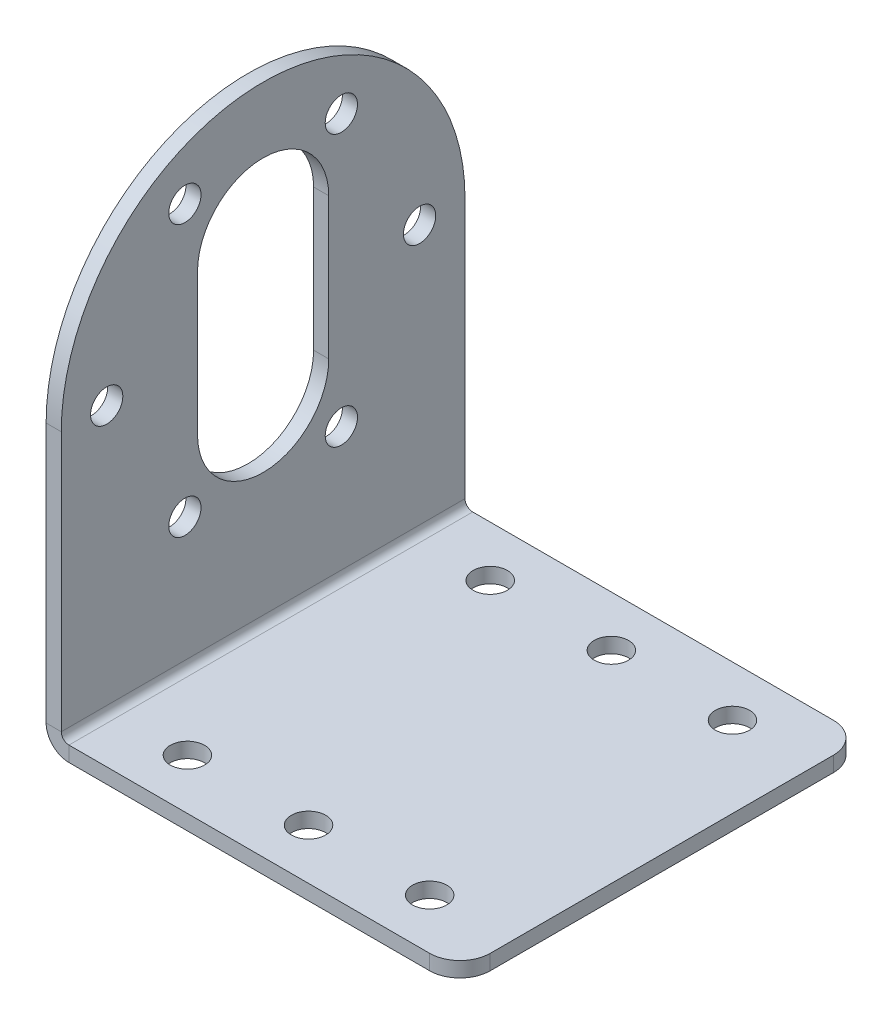
ISO-10303-21;
HEADER;
FILE_DESCRIPTION(('STEP AP214'),'2;1');
FILE_NAME('part.step','',(''),(''),'','','');
FILE_SCHEMA(('AUTOMOTIVE_DESIGN { 1 0 10303 214 1 1 1 1 }'));
ENDSEC;
DATA;
#1=APPLICATION_CONTEXT('core data for automotive mechanical design processes');
#2=APPLICATION_PROTOCOL_DEFINITION('international standard','automotive_design',2000,#1);
#3=PRODUCT_CONTEXT('',#1,'mechanical');
#4=PRODUCT('Part','Part','',(#3));
#5=PRODUCT_RELATED_PRODUCT_CATEGORY('part','',(#4));
#6=PRODUCT_DEFINITION_FORMATION('','',#4);
#7=PRODUCT_DEFINITION_CONTEXT('part definition',#1,'design');
#8=PRODUCT_DEFINITION('design','',#6,#7);
#9=PRODUCT_DEFINITION_SHAPE('','',#8);
#10=(LENGTH_UNIT() NAMED_UNIT(*) SI_UNIT(.MILLI.,.METRE.));
#11=(NAMED_UNIT(*) PLANE_ANGLE_UNIT() SI_UNIT($,.RADIAN.));
#12=(NAMED_UNIT(*) SI_UNIT($,.STERADIAN.) SOLID_ANGLE_UNIT());
#13=UNCERTAINTY_MEASURE_WITH_UNIT(LENGTH_MEASURE(1.E-05),#10,'distance_accuracy_value','');
#14=(GEOMETRIC_REPRESENTATION_CONTEXT(3) GLOBAL_UNCERTAINTY_ASSIGNED_CONTEXT((#13)) GLOBAL_UNIT_ASSIGNED_CONTEXT((#10,
#11,#12)) REPRESENTATION_CONTEXT('',''));
#15=CARTESIAN_POINT('',(0.,0.,0.));
#16=DIRECTION('',(0.,0.,1.));
#17=DIRECTION('',(1.,0.,0.));
#18=AXIS2_PLACEMENT_3D('',#15,#16,#17);
#19=CARTESIAN_POINT('',(0.,0.,0.));
#20=DIRECTION('',(1.,0.,0.));
#21=DIRECTION('',(0.,0.,-1.));
#22=AXIS2_PLACEMENT_3D('',#19,#20,#21);
#23=PLANE('',#22);
#24=DIRECTION('',(0.,-1.,0.));
#25=VECTOR('',#24,1.);
#26=CARTESIAN_POINT('',(-3.88578058618805E-13,6.99999999999999,-6.50000000000001));
#27=LINE('',#26,#25);
#28=CARTESIAN_POINT('',(-3.88578058618805E-13,6.99999999999999,-6.50000000000001));
#29=VERTEX_POINT('',#28);
#30=CARTESIAN_POINT('',(-3.88578058618805E-13,-7.00000000000001,-6.50000000000001));
#31=VERTEX_POINT('',#30);
#32=EDGE_CURVE('E158',#29,#31,#27,.T.);
#33=ORIENTED_EDGE('',*,*,#32,.F.);
#34=CARTESIAN_POINT('',(0.,7.,0.));
#35=DIRECTION('',(-1.,0.,0.));
#36=DIRECTION('',(0.,0.,1.));
#37=AXIS2_PLACEMENT_3D('',#34,#35,#36);
#38=CIRCLE('',#37,6.5);
#39=CARTESIAN_POINT('',(0.,7.,6.50000000000001));
#40=VERTEX_POINT('',#39);
#41=EDGE_CURVE('E163',#40,#29,#38,.T.);
#42=ORIENTED_EDGE('',*,*,#41,.F.);
#43=DIRECTION('',(0.,1.,0.));
#44=VECTOR('',#43,1.);
#45=CARTESIAN_POINT('',(0.,7.,6.50000000000001));
#46=LINE('',#45,#44);
#47=CARTESIAN_POINT('',(0.,-7.,6.50000000000001));
#48=VERTEX_POINT('',#47);
#49=EDGE_CURVE('E167',#48,#40,#46,.T.);
#50=ORIENTED_EDGE('',*,*,#49,.F.);
#51=CARTESIAN_POINT('',(0.,-7.,0.));
#52=DIRECTION('',(-1.,0.,0.));
#53=DIRECTION('',(0.,0.,1.));
#54=AXIS2_PLACEMENT_3D('',#51,#52,#53);
#55=CIRCLE('',#54,6.5);
#56=EDGE_CURVE('E147',#31,#48,#55,.T.);
#57=ORIENTED_EDGE('',*,*,#56,.F.);
#58=EDGE_LOOP('',(#33,#42,#50,#57));
#59=FACE_BOUND('',#58,.T.);
#60=CARTESIAN_POINT('',(0.,-13.423393758659,7.75000000000064));
#61=DIRECTION('',(-1.,0.,0.));
#62=DIRECTION('',(0.,0.,1.));
#63=AXIS2_PLACEMENT_3D('',#60,#61,#62);
#64=CIRCLE('',#63,1.6);
#65=CARTESIAN_POINT('',(0.,-13.423393758659,9.35000000000064));
#66=VERTEX_POINT('',#65);
#67=EDGE_CURVE('E182',#66,#66,#64,.T.);
#68=ORIENTED_EDGE('',*,*,#67,.F.);
#69=EDGE_LOOP('',(#68));
#70=FACE_BOUND('',#69,.T.);
#71=CARTESIAN_POINT('',(0.,13.4233937586588,7.75000000000009));
#72=DIRECTION('',(-1.,0.,0.));
#73=DIRECTION('',(0.,0.,1.));
#74=AXIS2_PLACEMENT_3D('',#71,#72,#73);
#75=CIRCLE('',#74,1.6);
#76=CARTESIAN_POINT('',(0.,13.4233937586588,9.35000000000009));
#77=VERTEX_POINT('',#76);
#78=EDGE_CURVE('E194',#77,#77,#75,.T.);
#79=ORIENTED_EDGE('',*,*,#78,.F.);
#80=EDGE_LOOP('',(#79));
#81=FACE_BOUND('',#80,.T.);
#82=CARTESIAN_POINT('',(-3.88578058618805E-13,13.4233937586587,-7.74999999999998));
#83=DIRECTION('',(-1.,0.,0.));
#84=DIRECTION('',(0.,0.,1.));
#85=AXIS2_PLACEMENT_3D('',#82,#83,#84);
#86=CIRCLE('',#85,1.6);
#87=CARTESIAN_POINT('',(-3.88578058618805E-13,13.4233937586587,-6.14999999999998));
#88=VERTEX_POINT('',#87);
#89=EDGE_CURVE('E200',#88,#88,#86,.T.);
#90=ORIENTED_EDGE('',*,*,#89,.F.);
#91=EDGE_LOOP('',(#90));
#92=FACE_BOUND('',#91,.T.);
#93=CARTESIAN_POINT('',(-3.88578058618805E-13,0.,-15.5));
#94=DIRECTION('',(-1.,0.,0.));
#95=DIRECTION('',(0.,0.,1.));
#96=AXIS2_PLACEMENT_3D('',#93,#94,#95);
#97=CIRCLE('',#96,1.6);
#98=CARTESIAN_POINT('',(-3.88578058618805E-13,0.,-13.9));
#99=VERTEX_POINT('',#98);
#100=EDGE_CURVE('E204',#99,#99,#97,.T.);
#101=ORIENTED_EDGE('',*,*,#100,.F.);
#102=EDGE_LOOP('',(#101));
#103=FACE_BOUND('',#102,.T.);
#104=DIRECTION('',(0.,1.,0.));
#105=VECTOR('',#104,1.);
#106=CARTESIAN_POINT('',(-3.88578058618805E-13,0.,-20.));
#107=LINE('',#106,#105);
#108=CARTESIAN_POINT('',(-3.88578058618805E-13,-25.7380000000001,-20.));
#109=VERTEX_POINT('',#108);
#110=CARTESIAN_POINT('',(-3.88578058618805E-13,0.,-20.));
#111=VERTEX_POINT('',#110);
#112=EDGE_CURVE('E225',#109,#111,#107,.T.);
#113=ORIENTED_EDGE('',*,*,#112,.F.);
#114=DIRECTION('',(0.,0.,-1.));
#115=VECTOR('',#114,1.);
#116=CARTESIAN_POINT('',(0.,-25.7380000000001,0.));
#117=LINE('',#116,#115);
#118=CARTESIAN_POINT('',(0.,-25.7380000000001,20.));
#119=VERTEX_POINT('',#118);
#120=EDGE_CURVE('E231',#109,#119,#117,.F.);
#121=ORIENTED_EDGE('',*,*,#120,.T.);
#122=DIRECTION('',(0.,-1.,0.));
#123=VECTOR('',#122,1.);
#124=CARTESIAN_POINT('',(0.,0.,20.));
#125=LINE('',#124,#123);
#126=CARTESIAN_POINT('',(0.,0.,20.));
#127=VERTEX_POINT('',#126);
#128=EDGE_CURVE('E219',#127,#119,#125,.T.);
#129=ORIENTED_EDGE('',*,*,#128,.F.);
#130=CARTESIAN_POINT('',(0.,0.,0.));
#131=DIRECTION('',(1.,0.,0.));
#132=DIRECTION('',(0.,0.,-1.));
#133=AXIS2_PLACEMENT_3D('',#130,#131,#132);
#134=CIRCLE('',#133,20.);
#135=EDGE_CURVE('E222',#111,#127,#134,.T.);
#136=ORIENTED_EDGE('',*,*,#135,.F.);
#137=EDGE_LOOP('',(#113,#121,#129,#136));
#138=FACE_BOUND('',#137,.T.);
#139=CARTESIAN_POINT('',(0.,0.,15.5));
#140=DIRECTION('',(-1.,0.,0.));
#141=DIRECTION('',(0.,0.,1.));
#142=AXIS2_PLACEMENT_3D('',#139,#140,#141);
#143=CIRCLE('',#142,1.6);
#144=CARTESIAN_POINT('',(0.,0.,17.1));
#145=VERTEX_POINT('',#144);
#146=EDGE_CURVE('E188',#145,#145,#143,.T.);
#147=ORIENTED_EDGE('',*,*,#146,.F.);
#148=EDGE_LOOP('',(#147));
#149=FACE_BOUND('',#148,.T.);
#150=CARTESIAN_POINT('',(-3.88578058618805E-13,-13.4233937586589,-7.74999999999937));
#151=DIRECTION('',(-1.,0.,0.));
#152=DIRECTION('',(0.,0.,1.));
#153=AXIS2_PLACEMENT_3D('',#150,#151,#152);
#154=CIRCLE('',#153,1.6);
#155=CARTESIAN_POINT('',(-3.88578058618805E-13,-13.4233937586589,-6.14999999999937));
#156=VERTEX_POINT('',#155);
#157=EDGE_CURVE('E174',#156,#156,#154,.T.);
#158=ORIENTED_EDGE('',*,*,#157,.F.);
#159=EDGE_LOOP('',(#158));
#160=FACE_BOUND('',#159,.T.);
#161=ADVANCED_FACE('F39',(#59,#70,#81,#92,#103,#138,#149,#160),#23,.F.);
#162=CARTESIAN_POINT('',(1.49999999999961,-28.0000000000001,-20.));
#163=DIRECTION('',(0.,0.,-1.));
#164=DIRECTION('',(-1.,0.,0.));
#165=AXIS2_PLACEMENT_3D('',#162,#163,#164);
#166=PLANE('',#165);
#167=DIRECTION('',(1.,0.,0.));
#168=VECTOR('',#167,1.);
#169=CARTESIAN_POINT('',(1.49999999999961,-26.5000000000001,-20.));
#170=LINE('',#169,#168);
#171=CARTESIAN_POINT('',(37.9999999999996,-26.5000000000001,-20.));
#172=VERTEX_POINT('',#171);
#173=CARTESIAN_POINT('',(2.26199999999963,-26.5000000000001,-20.));
#174=VERTEX_POINT('',#173);
#175=EDGE_CURVE('E259',#172,#174,#170,.F.);
#176=ORIENTED_EDGE('',*,*,#175,.F.);
#177=DIRECTION('',(0.,1.,0.));
#178=VECTOR('',#177,1.);
#179=CARTESIAN_POINT('',(37.9999999999996,-28.0000000000001,-20.));
#180=LINE('',#179,#178);
#181=CARTESIAN_POINT('',(37.9999999999996,-28.0000000000001,-20.));
#182=VERTEX_POINT('',#181);
#183=EDGE_CURVE('E288',#172,#182,#180,.F.);
#184=ORIENTED_EDGE('',*,*,#183,.T.);
#185=DIRECTION('',(-1.,0.,0.));
#186=VECTOR('',#185,1.);
#187=CARTESIAN_POINT('',(1.49999999999961,-28.0000000000001,-20.));
#188=LINE('',#187,#186);
#189=CARTESIAN_POINT('',(2.26199999999963,-28.0000000000001,-20.));
#190=VERTEX_POINT('',#189);
#191=EDGE_CURVE('E211',#182,#190,#188,.T.);
#192=ORIENTED_EDGE('',*,*,#191,.T.);
#193=DIRECTION('',(0.,-1.,0.));
#194=VECTOR('',#193,1.);
#195=CARTESIAN_POINT('',(2.26199999999963,-28.0000000000001,-20.));
#196=LINE('',#195,#194);
#197=EDGE_CURVE('E275',#174,#190,#196,.T.);
#198=ORIENTED_EDGE('',*,*,#197,.F.);
#199=EDGE_LOOP('',(#176,#184,#192,#198));
#200=FACE_BOUND('',#199,.T.);
#201=ADVANCED_FACE('F397',(#200),#166,.T.);
#202=CARTESIAN_POINT('',(41.,-28.0000000000001,20.));
#203=DIRECTION('',(-1.,0.,0.));
#204=DIRECTION('',(0.,0.,1.));
#205=AXIS2_PLACEMENT_3D('',#202,#203,#204);
#206=PLANE('',#205);
#207=DIRECTION('',(0.,0.,1.));
#208=VECTOR('',#207,1.);
#209=CARTESIAN_POINT('',(41.,-28.0000000000001,20.));
#210=LINE('',#209,#208);
#211=CARTESIAN_POINT('',(40.9999999999996,-28.0000000000001,-17.));
#212=VERTEX_POINT('',#211);
#213=CARTESIAN_POINT('',(41.,-28.0000000000001,17.));
#214=VERTEX_POINT('',#213);
#215=EDGE_CURVE('E213',#212,#214,#210,.T.);
#216=ORIENTED_EDGE('',*,*,#215,.F.);
#217=DIRECTION('',(0.,-1.,0.));
#218=VECTOR('',#217,1.);
#219=CARTESIAN_POINT('',(40.9999999999996,-28.0000000000001,-17.));
#220=LINE('',#219,#218);
#221=CARTESIAN_POINT('',(40.9999999999996,-26.5000000000001,-17.));
#222=VERTEX_POINT('',#221);
#223=EDGE_CURVE('E298',#212,#222,#220,.F.);
#224=ORIENTED_EDGE('',*,*,#223,.T.);
#225=DIRECTION('',(0.,0.,1.));
#226=VECTOR('',#225,1.);
#227=CARTESIAN_POINT('',(41.,-26.5000000000001,20.));
#228=LINE('',#227,#226);
#229=CARTESIAN_POINT('',(41.,-26.5000000000001,17.));
#230=VERTEX_POINT('',#229);
#231=EDGE_CURVE('E261',#222,#230,#228,.T.);
#232=ORIENTED_EDGE('',*,*,#231,.T.);
#233=DIRECTION('',(0.,1.,0.));
#234=VECTOR('',#233,1.);
#235=CARTESIAN_POINT('',(41.,-28.0000000000001,17.));
#236=LINE('',#235,#234);
#237=EDGE_CURVE('E295',#230,#214,#236,.F.);
#238=ORIENTED_EDGE('',*,*,#237,.T.);
#239=EDGE_LOOP('',(#216,#224,#232,#238));
#240=FACE_BOUND('',#239,.T.);
#241=ADVANCED_FACE('F407',(#240),#206,.F.);
#242=CARTESIAN_POINT('',(1.5,-28.0000000000001,20.));
#243=DIRECTION('',(0.,0.,-1.));
#244=DIRECTION('',(-1.,0.,0.));
#245=AXIS2_PLACEMENT_3D('',#242,#243,#244);
#246=PLANE('',#245);
#247=DIRECTION('',(-1.,0.,0.));
#248=VECTOR('',#247,1.);
#249=CARTESIAN_POINT('',(1.5,-28.0000000000001,20.));
#250=LINE('',#249,#248);
#251=CARTESIAN_POINT('',(38.,-28.0000000000001,20.));
#252=VERTEX_POINT('',#251);
#253=CARTESIAN_POINT('',(2.26200000000001,-28.0000000000001,20.));
#254=VERTEX_POINT('',#253);
#255=EDGE_CURVE('E217',#252,#254,#250,.T.);
#256=ORIENTED_EDGE('',*,*,#255,.F.);
#257=DIRECTION('',(0.,1.,0.));
#258=VECTOR('',#257,1.);
#259=CARTESIAN_POINT('',(38.,-28.0000000000001,20.));
#260=LINE('',#259,#258);
#261=CARTESIAN_POINT('',(38.,-26.5000000000001,20.));
#262=VERTEX_POINT('',#261);
#263=EDGE_CURVE('E11',#252,#262,#260,.T.);
#264=ORIENTED_EDGE('',*,*,#263,.T.);
#265=DIRECTION('',(1.,0.,0.));
#266=VECTOR('',#265,1.);
#267=CARTESIAN_POINT('',(1.5,-26.5000000000001,20.));
#268=LINE('',#267,#266);
#269=CARTESIAN_POINT('',(2.26200000000001,-26.5000000000001,20.));
#270=VERTEX_POINT('',#269);
#271=EDGE_CURVE('E255',#262,#270,#268,.F.);
#272=ORIENTED_EDGE('',*,*,#271,.T.);
#273=DIRECTION('',(0.,-1.,0.));
#274=VECTOR('',#273,1.);
#275=CARTESIAN_POINT('',(2.26200000000001,-28.0000000000001,20.));
#276=LINE('',#275,#274);
#277=EDGE_CURVE('E272',#270,#254,#276,.T.);
#278=ORIENTED_EDGE('',*,*,#277,.T.);
#279=EDGE_LOOP('',(#256,#264,#272,#278));
#280=FACE_BOUND('',#279,.T.);
#281=ADVANCED_FACE('F403',(#280),#246,.F.);
#282=CARTESIAN_POINT('',(2.26200000000001,-25.7380000000001,20.));
#283=DIRECTION('',(0.,0.,1.));
#284=DIRECTION('',(0.,-1.,0.));
#285=AXIS2_PLACEMENT_3D('',#282,#283,#284);
#286=PLANE('',#285);
#287=ORIENTED_EDGE('',*,*,#277,.F.);
#288=CARTESIAN_POINT('',(2.26200000000001,-25.7380000000001,20.));
#289=DIRECTION('',(0.,0.,-1.));
#290=DIRECTION('',(-1.,0.,0.));
#291=AXIS2_PLACEMENT_3D('',#288,#289,#290);
#292=CIRCLE('',#291,0.762);
#293=CARTESIAN_POINT('',(1.5,-25.7380000000001,20.));
#294=VERTEX_POINT('',#293);
#295=EDGE_CURVE('E256',#270,#294,#292,.T.);
#296=ORIENTED_EDGE('',*,*,#295,.T.);
#297=DIRECTION('',(-1.,0.,0.));
#298=VECTOR('',#297,1.);
#299=CARTESIAN_POINT('',(0.,-25.7380000000001,20.));
#300=LINE('',#299,#298);
#301=EDGE_CURVE('E270',#294,#119,#300,.T.);
#302=ORIENTED_EDGE('',*,*,#301,.T.);
#303=CARTESIAN_POINT('',(2.26200000000001,-25.7380000000001,20.));
#304=DIRECTION('',(0.,0.,-1.));
#305=DIRECTION('',(0.,1.,0.));
#306=AXIS2_PLACEMENT_3D('',#303,#304,#305);
#307=CIRCLE('',#306,2.262);
#308=EDGE_CURVE('E214',#254,#119,#307,.T.);
#309=ORIENTED_EDGE('',*,*,#308,.F.);
#310=EDGE_LOOP('',(#287,#296,#302,#309));
#311=FACE_BOUND('',#310,.T.);
#312=ADVANCED_FACE('F387',(#311),#286,.T.);
#313=CARTESIAN_POINT('',(0.,0.,20.));
#314=DIRECTION('',(0.,0.,1.));
#315=DIRECTION('',(0.,-1.,0.));
#316=AXIS2_PLACEMENT_3D('',#313,#314,#315);
#317=PLANE('',#316);
#318=ORIENTED_EDGE('',*,*,#301,.F.);
#319=DIRECTION('',(0.,1.,0.));
#320=VECTOR('',#319,1.);
#321=CARTESIAN_POINT('',(1.5,-2.91433543964104E-13,20.));
#322=LINE('',#321,#320);
#323=CARTESIAN_POINT('',(1.5,-2.91433543964104E-13,20.));
#324=VERTEX_POINT('',#323);
#325=EDGE_CURVE('E252',#324,#294,#322,.F.);
#326=ORIENTED_EDGE('',*,*,#325,.F.);
#327=DIRECTION('',(-1.,0.,0.));
#328=VECTOR('',#327,1.);
#329=CARTESIAN_POINT('',(0.,0.,20.));
#330=LINE('',#329,#328);
#331=EDGE_CURVE('E268',#324,#127,#330,.T.);
#332=ORIENTED_EDGE('',*,*,#331,.T.);
#333=ORIENTED_EDGE('',*,*,#128,.T.);
#334=EDGE_LOOP('',(#318,#326,#332,#333));
#335=FACE_BOUND('',#334,.T.);
#336=ADVANCED_FACE('F378',(#335),#317,.T.);
#337=CARTESIAN_POINT('',(0.,0.,0.));
#338=DIRECTION('',(1.,0.,0.));
#339=DIRECTION('',(0.,0.,-1.));
#340=AXIS2_PLACEMENT_3D('',#337,#338,#339);
#341=CYLINDRICAL_SURFACE('',#340,20.);
#342=ORIENTED_EDGE('',*,*,#331,.F.);
#343=CARTESIAN_POINT('',(1.5,-1.94289029309402E-13,0.));
#344=DIRECTION('',(1.,0.,0.));
#345=DIRECTION('',(0.,0.,-1.));
#346=AXIS2_PLACEMENT_3D('',#343,#344,#345);
#347=CIRCLE('',#346,20.);
#348=CARTESIAN_POINT('',(1.49999999999961,-2.91433543964104E-13,-20.));
#349=VERTEX_POINT('',#348);
#350=EDGE_CURVE('E249',#349,#324,#347,.T.);
#351=ORIENTED_EDGE('',*,*,#350,.F.);
#352=DIRECTION('',(-1.,0.,0.));
#353=VECTOR('',#352,1.);
#354=CARTESIAN_POINT('',(-3.88578058618805E-13,0.,-20.));
#355=LINE('',#354,#353);
#356=EDGE_CURVE('E266',#349,#111,#355,.T.);
#357=ORIENTED_EDGE('',*,*,#356,.T.);
#358=ORIENTED_EDGE('',*,*,#135,.T.);
#359=EDGE_LOOP('',(#342,#351,#357,#358));
#360=FACE_BOUND('',#359,.T.);
#361=ADVANCED_FACE('F375',(#360),#341,.T.);
#362=CARTESIAN_POINT('',(-3.88578058618805E-13,0.,-20.));
#363=DIRECTION('',(0.,0.,-1.));
#364=DIRECTION('',(0.,1.,0.));
#365=AXIS2_PLACEMENT_3D('',#362,#363,#364);
#366=PLANE('',#365);
#367=ORIENTED_EDGE('',*,*,#356,.F.);
#368=DIRECTION('',(0.,1.,0.));
#369=VECTOR('',#368,1.);
#370=CARTESIAN_POINT('',(1.49999999999961,-2.91433543964104E-13,-20.));
#371=LINE('',#370,#369);
#372=CARTESIAN_POINT('',(1.49999999999961,-25.7380000000001,-20.));
#373=VERTEX_POINT('',#372);
#374=EDGE_CURVE('E246',#373,#349,#371,.T.);
#375=ORIENTED_EDGE('',*,*,#374,.F.);
#376=DIRECTION('',(-1.,0.,0.));
#377=VECTOR('',#376,1.);
#378=CARTESIAN_POINT('',(-3.88578058618805E-13,-25.7380000000001,-20.));
#379=LINE('',#378,#377);
#380=EDGE_CURVE('E234',#373,#109,#379,.T.);
#381=ORIENTED_EDGE('',*,*,#380,.T.);
#382=ORIENTED_EDGE('',*,*,#112,.T.);
#383=EDGE_LOOP('',(#367,#375,#381,#382));
#384=FACE_BOUND('',#383,.T.);
#385=ADVANCED_FACE('F370',(#384),#366,.T.);
#386=CARTESIAN_POINT('',(2.26199999999963,-25.7380000000001,-20.));
#387=DIRECTION('',(0.,0.,1.));
#388=DIRECTION('',(0.,-1.,0.));
#389=AXIS2_PLACEMENT_3D('',#386,#387,#388);
#390=PLANE('',#389);
#391=CARTESIAN_POINT('',(2.26199999999963,-25.7380000000001,-20.));
#392=DIRECTION('',(0.,0.,-1.));
#393=DIRECTION('',(-1.,0.,0.));
#394=AXIS2_PLACEMENT_3D('',#391,#392,#393);
#395=CIRCLE('',#394,0.762);
#396=EDGE_CURVE('E210',#373,#174,#395,.F.);
#397=ORIENTED_EDGE('',*,*,#396,.T.);
#398=ORIENTED_EDGE('',*,*,#197,.T.);
#399=CARTESIAN_POINT('',(2.26199999999963,-25.7380000000001,-20.));
#400=DIRECTION('',(0.,0.,-1.));
#401=DIRECTION('',(0.,1.,0.));
#402=AXIS2_PLACEMENT_3D('',#399,#400,#401);
#403=CIRCLE('',#402,2.262);
#404=EDGE_CURVE('E235',#109,#190,#403,.F.);
#405=ORIENTED_EDGE('',*,*,#404,.F.);
#406=ORIENTED_EDGE('',*,*,#380,.F.);
#407=EDGE_LOOP('',(#397,#398,#405,#406));
#408=FACE_BOUND('',#407,.T.);
#409=ADVANCED_FACE('F393',(#408),#390,.F.);
#410=CARTESIAN_POINT('',(1.5,-28.0000000000001,20.));
#411=DIRECTION('',(0.,1.,0.));
#412=DIRECTION('',(0.,0.,1.));
#413=AXIS2_PLACEMENT_3D('',#410,#411,#412);
#414=PLANE('',#413);
#415=CARTESIAN_POINT('',(20.9999999999996,-28.0000000000002,-15.));
#416=DIRECTION('',(0.,1.,0.));
#417=DIRECTION('',(0.,0.,1.));
#418=AXIS2_PLACEMENT_3D('',#415,#416,#417);
#419=CIRCLE('',#418,1.7);
#420=CARTESIAN_POINT('',(20.9999999999996,-28.0000000000002,-13.3));
#421=VERTEX_POINT('',#420);
#422=EDGE_CURVE('E303',#421,#421,#419,.T.);
#423=ORIENTED_EDGE('',*,*,#422,.T.);
#424=EDGE_LOOP('',(#423));
#425=FACE_BOUND('',#424,.T.);
#426=CARTESIAN_POINT('',(21.,-28.0000000000002,15.));
#427=DIRECTION('',(0.,1.,0.));
#428=DIRECTION('',(0.,0.,1.));
#429=AXIS2_PLACEMENT_3D('',#426,#427,#428);
#430=CIRCLE('',#429,1.7);
#431=CARTESIAN_POINT('',(21.,-28.0000000000002,16.7));
#432=VERTEX_POINT('',#431);
#433=EDGE_CURVE('E309',#432,#432,#430,.T.);
#434=ORIENTED_EDGE('',*,*,#433,.T.);
#435=EDGE_LOOP('',(#434));
#436=FACE_BOUND('',#435,.T.);
#437=CARTESIAN_POINT('',(8.99999999999962,-28.0000000000002,-15.));
#438=DIRECTION('',(0.,1.,0.));
#439=DIRECTION('',(0.,0.,1.));
#440=AXIS2_PLACEMENT_3D('',#437,#438,#439);
#441=CIRCLE('',#440,1.7);
#442=CARTESIAN_POINT('',(8.99999999999962,-28.0000000000002,-13.3));
#443=VERTEX_POINT('',#442);
#444=EDGE_CURVE('E307',#443,#443,#441,.T.);
#445=ORIENTED_EDGE('',*,*,#444,.T.);
#446=EDGE_LOOP('',(#445));
#447=FACE_BOUND('',#446,.T.);
#448=CARTESIAN_POINT('',(9.00000000000001,-28.0000000000001,15.));
#449=DIRECTION('',(0.,1.,0.));
#450=DIRECTION('',(0.,0.,1.));
#451=AXIS2_PLACEMENT_3D('',#448,#449,#450);
#452=CIRCLE('',#451,1.7);
#453=CARTESIAN_POINT('',(9.00000000000001,-28.0000000000001,16.7));
#454=VERTEX_POINT('',#453);
#455=EDGE_CURVE('E321',#454,#454,#452,.T.);
#456=ORIENTED_EDGE('',*,*,#455,.T.);
#457=EDGE_LOOP('',(#456));
#458=FACE_BOUND('',#457,.T.);
#459=CARTESIAN_POINT('',(33.,-28.0000000000001,15.));
#460=DIRECTION('',(0.,1.,0.));
#461=DIRECTION('',(0.,0.,1.));
#462=AXIS2_PLACEMENT_3D('',#459,#460,#461);
#463=CIRCLE('',#462,1.7);
#464=CARTESIAN_POINT('',(33.,-28.0000000000001,16.7));
#465=VERTEX_POINT('',#464);
#466=EDGE_CURVE('E330',#465,#465,#463,.T.);
#467=ORIENTED_EDGE('',*,*,#466,.T.);
#468=EDGE_LOOP('',(#467));
#469=FACE_BOUND('',#468,.T.);
#470=CARTESIAN_POINT('',(32.9999999999996,-28.0000000000002,-15.));
#471=DIRECTION('',(0.,1.,0.));
#472=DIRECTION('',(0.,0.,1.));
#473=AXIS2_PLACEMENT_3D('',#470,#471,#472);
#474=CIRCLE('',#473,1.7);
#475=CARTESIAN_POINT('',(32.9999999999996,-28.0000000000002,-13.3));
#476=VERTEX_POINT('',#475);
#477=EDGE_CURVE('E336',#476,#476,#474,.T.);
#478=ORIENTED_EDGE('',*,*,#477,.T.);
#479=EDGE_LOOP('',(#478));
#480=FACE_BOUND('',#479,.T.);
#481=ORIENTED_EDGE('',*,*,#191,.F.);
#482=CARTESIAN_POINT('',(37.9999999999996,-28.0000000000001,-17.));
#483=DIRECTION('',(0.,1.,0.));
#484=DIRECTION('',(0.,0.,1.));
#485=AXIS2_PLACEMENT_3D('',#482,#483,#484);
#486=CIRCLE('',#485,3.);
#487=EDGE_CURVE('E293',#182,#212,#486,.F.);
#488=ORIENTED_EDGE('',*,*,#487,.T.);
#489=ORIENTED_EDGE('',*,*,#215,.T.);
#490=CARTESIAN_POINT('',(38.,-28.0000000000001,17.));
#491=DIRECTION('',(0.,1.,0.));
#492=DIRECTION('',(0.,0.,1.));
#493=AXIS2_PLACEMENT_3D('',#490,#491,#492);
#494=CIRCLE('',#493,3.);
#495=EDGE_CURVE('E291',#214,#252,#494,.F.);
#496=ORIENTED_EDGE('',*,*,#495,.T.);
#497=ORIENTED_EDGE('',*,*,#255,.T.);
#498=DIRECTION('',(0.,0.,-1.));
#499=VECTOR('',#498,1.);
#500=CARTESIAN_POINT('',(2.26200000000001,-28.0000000000001,20.));
#501=LINE('',#500,#499);
#502=EDGE_CURVE('E228',#254,#190,#501,.T.);
#503=ORIENTED_EDGE('',*,*,#502,.T.);
#504=EDGE_LOOP('',(#481,#488,#489,#496,#497,#503));
#505=FACE_BOUND('',#504,.T.);
#506=ADVANCED_FACE('F401',(#425,#436,#447,#458,#469,#480,#505),#414,.F.);
#507=CARTESIAN_POINT('',(2.26200000000001,-25.7380000000001,20.));
#508=DIRECTION('',(0.,0.,-1.));
#509=DIRECTION('',(-1.,0.,0.));
#510=AXIS2_PLACEMENT_3D('',#507,#508,#509);
#511=CYLINDRICAL_SURFACE('',#510,2.262);
#512=ORIENTED_EDGE('',*,*,#308,.T.);
#513=ORIENTED_EDGE('',*,*,#120,.F.);
#514=ORIENTED_EDGE('',*,*,#404,.T.);
#515=ORIENTED_EDGE('',*,*,#502,.F.);
#516=EDGE_LOOP('',(#512,#513,#514,#515));
#517=FACE_BOUND('',#516,.T.);
#518=ADVANCED_FACE('F350',(#517),#511,.T.);
#519=CARTESIAN_POINT('',(1.5,-1.94289029309402E-13,0.));
#520=DIRECTION('',(1.,0.,0.));
#521=DIRECTION('',(0.,0.,-1.));
#522=AXIS2_PLACEMENT_3D('',#519,#520,#521);
#523=PLANE('',#522);
#524=CARTESIAN_POINT('',(1.5,6.9999999999998,0.));
#525=DIRECTION('',(1.,0.,0.));
#526=DIRECTION('',(0.,0.,-1.));
#527=AXIS2_PLACEMENT_3D('',#524,#525,#526);
#528=CIRCLE('',#527,6.5);
#529=CARTESIAN_POINT('',(1.49999999999961,6.99999999999971,-6.50000000000001));
#530=VERTEX_POINT('',#529);
#531=CARTESIAN_POINT('',(1.50000000000003,6.99999999999971,6.50000000000001));
#532=VERTEX_POINT('',#531);
#533=EDGE_CURVE('E286',#530,#532,#528,.T.);
#534=ORIENTED_EDGE('',*,*,#533,.F.);
#535=DIRECTION('',(0.,1.,0.));
#536=VECTOR('',#535,1.);
#537=CARTESIAN_POINT('',(1.49999999999961,-2.91433543964104E-13,-6.50000000000001));
#538=LINE('',#537,#536);
#539=CARTESIAN_POINT('',(1.49999999999961,-7.00000000000029,-6.50000000000001));
#540=VERTEX_POINT('',#539);
#541=EDGE_CURVE('E278',#540,#530,#538,.T.);
#542=ORIENTED_EDGE('',*,*,#541,.F.);
#543=CARTESIAN_POINT('',(1.5,-7.00000000000019,0.));
#544=DIRECTION('',(1.,0.,0.));
#545=DIRECTION('',(0.,0.,-1.));
#546=AXIS2_PLACEMENT_3D('',#543,#544,#545);
#547=CIRCLE('',#546,6.5);
#548=CARTESIAN_POINT('',(1.50000000000003,-7.00000000000028,6.50000000000001));
#549=VERTEX_POINT('',#548);
#550=EDGE_CURVE('E150',#549,#540,#547,.T.);
#551=ORIENTED_EDGE('',*,*,#550,.F.);
#552=DIRECTION('',(0.,-1.,0.));
#553=VECTOR('',#552,1.);
#554=CARTESIAN_POINT('',(1.5,-1.94289029309402E-13,6.50000000000001));
#555=LINE('',#554,#553);
#556=EDGE_CURVE('E284',#532,#549,#555,.T.);
#557=ORIENTED_EDGE('',*,*,#556,.F.);
#558=EDGE_LOOP('',(#534,#542,#551,#557));
#559=FACE_BOUND('',#558,.T.);
#560=CARTESIAN_POINT('',(1.49999999999961,-13.4233937586589,-7.74999999999937));
#561=DIRECTION('',(1.,0.,0.));
#562=DIRECTION('',(0.,0.,-1.));
#563=AXIS2_PLACEMENT_3D('',#560,#561,#562);
#564=CIRCLE('',#563,1.59999999999999);
#565=CARTESIAN_POINT('',(1.49999999999961,-13.4233937586589,-9.34999999999936));
#566=VERTEX_POINT('',#565);
#567=EDGE_CURVE('E179',#566,#566,#564,.T.);
#568=ORIENTED_EDGE('',*,*,#567,.F.);
#569=EDGE_LOOP('',(#568));
#570=FACE_BOUND('',#569,.T.);
#571=CARTESIAN_POINT('',(1.5,-13.423393758659,7.75000000000064));
#572=DIRECTION('',(1.,0.,0.));
#573=DIRECTION('',(0.,0.,-1.));
#574=AXIS2_PLACEMENT_3D('',#571,#572,#573);
#575=CIRCLE('',#574,1.59999999999999);
#576=CARTESIAN_POINT('',(1.5,-13.423393758659,6.15000000000065));
#577=VERTEX_POINT('',#576);
#578=EDGE_CURVE('E185',#577,#577,#575,.T.);
#579=ORIENTED_EDGE('',*,*,#578,.F.);
#580=EDGE_LOOP('',(#579));
#581=FACE_BOUND('',#580,.T.);
#582=CARTESIAN_POINT('',(1.5,-2.91433543964104E-13,15.5));
#583=DIRECTION('',(1.,0.,0.));
#584=DIRECTION('',(0.,0.,-1.));
#585=AXIS2_PLACEMENT_3D('',#582,#583,#584);
#586=CIRCLE('',#585,1.59999999999999);
#587=CARTESIAN_POINT('',(1.5,-2.91433543964104E-13,13.9));
#588=VERTEX_POINT('',#587);
#589=EDGE_CURVE('E191',#588,#588,#586,.T.);
#590=ORIENTED_EDGE('',*,*,#589,.F.);
#591=EDGE_LOOP('',(#590));
#592=FACE_BOUND('',#591,.T.);
#593=CARTESIAN_POINT('',(1.5,13.4233937586585,7.75000000000009));
#594=DIRECTION('',(1.,0.,0.));
#595=DIRECTION('',(0.,0.,-1.));
#596=AXIS2_PLACEMENT_3D('',#593,#594,#595);
#597=CIRCLE('',#596,1.59999999999999);
#598=CARTESIAN_POINT('',(1.5,13.4233937586585,6.1500000000001));
#599=VERTEX_POINT('',#598);
#600=EDGE_CURVE('E197',#599,#599,#597,.T.);
#601=ORIENTED_EDGE('',*,*,#600,.F.);
#602=EDGE_LOOP('',(#601));
#603=FACE_BOUND('',#602,.T.);
#604=CARTESIAN_POINT('',(1.49999999999961,13.4233937586584,-7.74999999999998));
#605=DIRECTION('',(1.,0.,0.));
#606=DIRECTION('',(0.,0.,-1.));
#607=AXIS2_PLACEMENT_3D('',#604,#605,#606);
#608=CIRCLE('',#607,1.59999999999999);
#609=CARTESIAN_POINT('',(1.49999999999961,13.4233937586584,-9.34999999999997));
#610=VERTEX_POINT('',#609);
#611=EDGE_CURVE('E203',#610,#610,#608,.T.);
#612=ORIENTED_EDGE('',*,*,#611,.F.);
#613=EDGE_LOOP('',(#612));
#614=FACE_BOUND('',#613,.T.);
#615=CARTESIAN_POINT('',(1.49999999999961,-1.94289029309402E-13,-15.5));
#616=DIRECTION('',(1.,0.,0.));
#617=DIRECTION('',(0.,0.,-1.));
#618=AXIS2_PLACEMENT_3D('',#615,#616,#617);
#619=CIRCLE('',#618,1.59999999999999);
#620=CARTESIAN_POINT('',(1.49999999999961,-1.94289029309402E-13,-17.1));
#621=VERTEX_POINT('',#620);
#622=EDGE_CURVE('E207',#621,#621,#619,.T.);
#623=ORIENTED_EDGE('',*,*,#622,.F.);
#624=EDGE_LOOP('',(#623));
#625=FACE_BOUND('',#624,.T.);
#626=ORIENTED_EDGE('',*,*,#374,.T.);
#627=ORIENTED_EDGE('',*,*,#350,.T.);
#628=ORIENTED_EDGE('',*,*,#325,.T.);
#629=DIRECTION('',(0.,0.,-1.));
#630=VECTOR('',#629,1.);
#631=CARTESIAN_POINT('',(1.5,-25.7380000000001,0.));
#632=LINE('',#631,#630);
#633=EDGE_CURVE('E238',#373,#294,#632,.F.);
#634=ORIENTED_EDGE('',*,*,#633,.F.);
#635=EDGE_LOOP('',(#626,#627,#628,#634));
#636=FACE_BOUND('',#635,.T.);
#637=ADVANCED_FACE('F346',(#559,#570,#581,#592,#603,#614,#625,#636),#523,.T.);
#638=CARTESIAN_POINT('',(1.5,-26.5000000000001,20.));
#639=DIRECTION('',(0.,1.,0.));
#640=DIRECTION('',(0.,0.,1.));
#641=AXIS2_PLACEMENT_3D('',#638,#639,#640);
#642=PLANE('',#641);
#643=CARTESIAN_POINT('',(20.9999999999996,-26.5000000000001,-15.));
#644=DIRECTION('',(0.,1.,0.));
#645=DIRECTION('',(-1.,0.,0.));
#646=AXIS2_PLACEMENT_3D('',#643,#644,#645);
#647=CIRCLE('',#646,1.7);
#648=CARTESIAN_POINT('',(19.2999999999996,-26.5000000000001,-15.));
#649=VERTEX_POINT('',#648);
#650=EDGE_CURVE('E43',#649,#649,#647,.T.);
#651=ORIENTED_EDGE('',*,*,#650,.F.);
#652=EDGE_LOOP('',(#651));
#653=FACE_BOUND('',#652,.T.);
#654=CARTESIAN_POINT('',(21.,-26.5000000000001,15.));
#655=DIRECTION('',(0.,1.,0.));
#656=DIRECTION('',(-1.,0.,0.));
#657=AXIS2_PLACEMENT_3D('',#654,#655,#656);
#658=CIRCLE('',#657,1.7);
#659=CARTESIAN_POINT('',(19.3,-26.5000000000001,15.));
#660=VERTEX_POINT('',#659);
#661=EDGE_CURVE('E301',#660,#660,#658,.T.);
#662=ORIENTED_EDGE('',*,*,#661,.F.);
#663=EDGE_LOOP('',(#662));
#664=FACE_BOUND('',#663,.T.);
#665=CARTESIAN_POINT('',(8.99999999999962,-26.5000000000001,-15.));
#666=DIRECTION('',(0.,1.,0.));
#667=DIRECTION('',(0.,0.,1.));
#668=AXIS2_PLACEMENT_3D('',#665,#666,#667);
#669=CIRCLE('',#668,1.7);
#670=CARTESIAN_POINT('',(8.99999999999962,-26.5000000000001,-13.3));
#671=VERTEX_POINT('',#670);
#672=EDGE_CURVE('E318',#671,#671,#669,.T.);
#673=ORIENTED_EDGE('',*,*,#672,.F.);
#674=EDGE_LOOP('',(#673));
#675=FACE_BOUND('',#674,.T.);
#676=CARTESIAN_POINT('',(9.00000000000001,-26.5000000000001,15.));
#677=DIRECTION('',(0.,1.,0.));
#678=DIRECTION('',(0.,0.,1.));
#679=AXIS2_PLACEMENT_3D('',#676,#677,#678);
#680=CIRCLE('',#679,1.7);
#681=CARTESIAN_POINT('',(9.00000000000001,-26.5000000000001,16.7));
#682=VERTEX_POINT('',#681);
#683=EDGE_CURVE('E324',#682,#682,#680,.T.);
#684=ORIENTED_EDGE('',*,*,#683,.F.);
#685=EDGE_LOOP('',(#684));
#686=FACE_BOUND('',#685,.T.);
#687=CARTESIAN_POINT('',(33.,-26.5000000000001,15.));
#688=DIRECTION('',(0.,1.,0.));
#689=DIRECTION('',(0.,0.,1.));
#690=AXIS2_PLACEMENT_3D('',#687,#688,#689);
#691=CIRCLE('',#690,1.7);
#692=CARTESIAN_POINT('',(33.,-26.5000000000001,16.7));
#693=VERTEX_POINT('',#692);
#694=EDGE_CURVE('E327',#693,#693,#691,.T.);
#695=ORIENTED_EDGE('',*,*,#694,.F.);
#696=EDGE_LOOP('',(#695));
#697=FACE_BOUND('',#696,.T.);
#698=CARTESIAN_POINT('',(32.9999999999996,-26.5000000000001,-15.));
#699=DIRECTION('',(0.,1.,0.));
#700=DIRECTION('',(0.,0.,1.));
#701=AXIS2_PLACEMENT_3D('',#698,#699,#700);
#702=CIRCLE('',#701,1.7);
#703=CARTESIAN_POINT('',(32.9999999999996,-26.5000000000001,-13.3));
#704=VERTEX_POINT('',#703);
#705=EDGE_CURVE('E333',#704,#704,#702,.T.);
#706=ORIENTED_EDGE('',*,*,#705,.F.);
#707=EDGE_LOOP('',(#706));
#708=FACE_BOUND('',#707,.T.);
#709=ORIENTED_EDGE('',*,*,#231,.F.);
#710=CARTESIAN_POINT('',(37.9999999999996,-26.5000000000001,-17.));
#711=DIRECTION('',(0.,1.,0.));
#712=DIRECTION('',(0.,0.,1.));
#713=AXIS2_PLACEMENT_3D('',#710,#711,#712);
#714=CIRCLE('',#713,3.);
#715=EDGE_CURVE('E48',#222,#172,#714,.T.);
#716=ORIENTED_EDGE('',*,*,#715,.T.);
#717=ORIENTED_EDGE('',*,*,#175,.T.);
#718=DIRECTION('',(0.,0.,1.));
#719=VECTOR('',#718,1.);
#720=CARTESIAN_POINT('',(2.26200000000001,-26.5000000000001,20.));
#721=LINE('',#720,#719);
#722=EDGE_CURVE('E243',#270,#174,#721,.F.);
#723=ORIENTED_EDGE('',*,*,#722,.F.);
#724=ORIENTED_EDGE('',*,*,#271,.F.);
#725=CARTESIAN_POINT('',(38.,-26.5000000000001,17.));
#726=DIRECTION('',(0.,1.,0.));
#727=DIRECTION('',(0.,0.,1.));
#728=AXIS2_PLACEMENT_3D('',#725,#726,#727);
#729=CIRCLE('',#728,3.);
#730=EDGE_CURVE('E61',#262,#230,#729,.T.);
#731=ORIENTED_EDGE('',*,*,#730,.T.);
#732=EDGE_LOOP('',(#709,#716,#717,#723,#724,#731));
#733=FACE_BOUND('',#732,.T.);
#734=ADVANCED_FACE('F349',(#653,#664,#675,#686,#697,#708,#733),#642,.T.);
#735=CARTESIAN_POINT('',(2.26200000000001,-25.7380000000001,20.));
#736=DIRECTION('',(0.,0.,-1.));
#737=DIRECTION('',(-1.,0.,0.));
#738=AXIS2_PLACEMENT_3D('',#735,#736,#737);
#739=CYLINDRICAL_SURFACE('',#738,0.762);
#740=ORIENTED_EDGE('',*,*,#295,.F.);
#741=ORIENTED_EDGE('',*,*,#722,.T.);
#742=ORIENTED_EDGE('',*,*,#396,.F.);
#743=ORIENTED_EDGE('',*,*,#633,.T.);
#744=EDGE_LOOP('',(#740,#741,#742,#743));
#745=FACE_BOUND('',#744,.T.);
#746=ADVANCED_FACE('F391',(#745),#739,.F.);
#747=CARTESIAN_POINT('',(-3.88578058618805E-13,0.,-15.5));
#748=DIRECTION('',(-1.,0.,0.));
#749=DIRECTION('',(0.,0.,1.));
#750=AXIS2_PLACEMENT_3D('',#747,#748,#749);
#751=CYLINDRICAL_SURFACE('',#750,1.59999999999999);
#752=ORIENTED_EDGE('',*,*,#622,.T.);
#753=EDGE_LOOP('',(#752));
#754=FACE_BOUND('',#753,.T.);
#755=ORIENTED_EDGE('',*,*,#100,.T.);
#756=EDGE_LOOP('',(#755));
#757=FACE_BOUND('',#756,.T.);
#758=ADVANCED_FACE('F439',(#754,#757),#751,.F.);
#759=CARTESIAN_POINT('',(-3.88578058618805E-13,13.4233937586587,-7.74999999999998));
#760=DIRECTION('',(-1.,0.,0.));
#761=DIRECTION('',(0.,0.,1.));
#762=AXIS2_PLACEMENT_3D('',#759,#760,#761);
#763=CYLINDRICAL_SURFACE('',#762,1.59999999999999);
#764=ORIENTED_EDGE('',*,*,#611,.T.);
#765=EDGE_LOOP('',(#764));
#766=FACE_BOUND('',#765,.T.);
#767=ORIENTED_EDGE('',*,*,#89,.T.);
#768=EDGE_LOOP('',(#767));
#769=FACE_BOUND('',#768,.T.);
#770=ADVANCED_FACE('F506',(#766,#769),#763,.F.);
#771=CARTESIAN_POINT('',(0.,13.4233937586588,7.75000000000009));
#772=DIRECTION('',(-1.,0.,0.));
#773=DIRECTION('',(0.,0.,1.));
#774=AXIS2_PLACEMENT_3D('',#771,#772,#773);
#775=CYLINDRICAL_SURFACE('',#774,1.59999999999999);
#776=ORIENTED_EDGE('',*,*,#600,.T.);
#777=EDGE_LOOP('',(#776));
#778=FACE_BOUND('',#777,.T.);
#779=ORIENTED_EDGE('',*,*,#78,.T.);
#780=EDGE_LOOP('',(#779));
#781=FACE_BOUND('',#780,.T.);
#782=ADVANCED_FACE('F502',(#778,#781),#775,.F.);
#783=CARTESIAN_POINT('',(0.,0.,15.5));
#784=DIRECTION('',(-1.,0.,0.));
#785=DIRECTION('',(0.,0.,1.));
#786=AXIS2_PLACEMENT_3D('',#783,#784,#785);
#787=CYLINDRICAL_SURFACE('',#786,1.59999999999999);
#788=ORIENTED_EDGE('',*,*,#589,.T.);
#789=EDGE_LOOP('',(#788));
#790=FACE_BOUND('',#789,.T.);
#791=ORIENTED_EDGE('',*,*,#146,.T.);
#792=EDGE_LOOP('',(#791));
#793=FACE_BOUND('',#792,.T.);
#794=ADVANCED_FACE('F498',(#790,#793),#787,.F.);
#795=CARTESIAN_POINT('',(0.,-13.423393758659,7.75000000000064));
#796=DIRECTION('',(-1.,0.,0.));
#797=DIRECTION('',(0.,0.,1.));
#798=AXIS2_PLACEMENT_3D('',#795,#796,#797);
#799=CYLINDRICAL_SURFACE('',#798,1.59999999999999);
#800=ORIENTED_EDGE('',*,*,#578,.T.);
#801=EDGE_LOOP('',(#800));
#802=FACE_BOUND('',#801,.T.);
#803=ORIENTED_EDGE('',*,*,#67,.T.);
#804=EDGE_LOOP('',(#803));
#805=FACE_BOUND('',#804,.T.);
#806=ADVANCED_FACE('F494',(#802,#805),#799,.F.);
#807=CARTESIAN_POINT('',(-3.88578058618805E-13,-13.4233937586589,-7.74999999999937));
#808=DIRECTION('',(-1.,0.,0.));
#809=DIRECTION('',(0.,0.,1.));
#810=AXIS2_PLACEMENT_3D('',#807,#808,#809);
#811=CYLINDRICAL_SURFACE('',#810,1.59999999999999);
#812=ORIENTED_EDGE('',*,*,#567,.T.);
#813=EDGE_LOOP('',(#812));
#814=FACE_BOUND('',#813,.T.);
#815=ORIENTED_EDGE('',*,*,#157,.T.);
#816=EDGE_LOOP('',(#815));
#817=FACE_BOUND('',#816,.T.);
#818=ADVANCED_FACE('F491',(#814,#817),#811,.F.);
#819=CARTESIAN_POINT('',(41.,7.,7.7715611723761E-13));
#820=DIRECTION('',(-1.,0.,0.));
#821=DIRECTION('',(0.,0.,1.));
#822=AXIS2_PLACEMENT_3D('',#819,#820,#821);
#823=CYLINDRICAL_SURFACE('',#822,6.5);
#824=ORIENTED_EDGE('',*,*,#533,.T.);
#825=DIRECTION('',(-1.,0.,0.));
#826=VECTOR('',#825,1.);
#827=CARTESIAN_POINT('',(41.,6.9999999999999,6.50000000000078));
#828=LINE('',#827,#826);
#829=EDGE_CURVE('E172',#532,#40,#828,.T.);
#830=ORIENTED_EDGE('',*,*,#829,.T.);
#831=ORIENTED_EDGE('',*,*,#41,.T.);
#832=DIRECTION('',(-1.,0.,0.));
#833=VECTOR('',#832,1.);
#834=CARTESIAN_POINT('',(40.9999999999996,6.9999999999999,-6.49999999999923));
#835=LINE('',#834,#833);
#836=EDGE_CURVE('E154',#530,#29,#835,.T.);
#837=ORIENTED_EDGE('',*,*,#836,.F.);
#838=EDGE_LOOP('',(#824,#830,#831,#837));
#839=FACE_BOUND('',#838,.T.);
#840=ADVANCED_FACE('F339',(#839),#823,.F.);
#841=CARTESIAN_POINT('',(41.,6.9999999999999,6.50000000000078));
#842=DIRECTION('',(0.,0.,1.));
#843=DIRECTION('',(0.,-1.,0.));
#844=AXIS2_PLACEMENT_3D('',#841,#842,#843);
#845=PLANE('',#844);
#846=ORIENTED_EDGE('',*,*,#556,.T.);
#847=DIRECTION('',(-1.,0.,0.));
#848=VECTOR('',#847,1.);
#849=CARTESIAN_POINT('',(41.,-7.0000000000001,6.49999999999962));
#850=LINE('',#849,#848);
#851=EDGE_CURVE('E153',#549,#48,#850,.T.);
#852=ORIENTED_EDGE('',*,*,#851,.T.);
#853=ORIENTED_EDGE('',*,*,#49,.T.);
#854=ORIENTED_EDGE('',*,*,#829,.F.);
#855=EDGE_LOOP('',(#846,#852,#853,#854));
#856=FACE_BOUND('',#855,.T.);
#857=ADVANCED_FACE('F344',(#856),#845,.F.);
#858=CARTESIAN_POINT('',(41.,-7.,-3.88578058618805E-13));
#859=DIRECTION('',(-1.,0.,0.));
#860=DIRECTION('',(0.,0.,1.));
#861=AXIS2_PLACEMENT_3D('',#858,#859,#860);
#862=CYLINDRICAL_SURFACE('',#861,6.5);
#863=ORIENTED_EDGE('',*,*,#550,.T.);
#864=DIRECTION('',(-1.,0.,0.));
#865=VECTOR('',#864,1.);
#866=CARTESIAN_POINT('',(40.9999999999996,-7.0000000000001,-6.50000000000039));
#867=LINE('',#866,#865);
#868=EDGE_CURVE('E142',#540,#31,#867,.T.);
#869=ORIENTED_EDGE('',*,*,#868,.T.);
#870=ORIENTED_EDGE('',*,*,#56,.T.);
#871=ORIENTED_EDGE('',*,*,#851,.F.);
#872=EDGE_LOOP('',(#863,#869,#870,#871));
#873=FACE_BOUND('',#872,.T.);
#874=ADVANCED_FACE('F144',(#873),#862,.F.);
#875=CARTESIAN_POINT('',(40.9999999999996,6.9999999999999,-6.49999999999923));
#876=DIRECTION('',(0.,0.,-1.));
#877=DIRECTION('',(0.,1.,0.));
#878=AXIS2_PLACEMENT_3D('',#875,#876,#877);
#879=PLANE('',#878);
#880=ORIENTED_EDGE('',*,*,#541,.T.);
#881=ORIENTED_EDGE('',*,*,#836,.T.);
#882=ORIENTED_EDGE('',*,*,#32,.T.);
#883=ORIENTED_EDGE('',*,*,#868,.F.);
#884=EDGE_LOOP('',(#880,#881,#882,#883));
#885=FACE_BOUND('',#884,.T.);
#886=ADVANCED_FACE('F159',(#885),#879,.F.);
#887=CARTESIAN_POINT('',(32.9999999999996,-26.5000000000001,-15.));
#888=DIRECTION('',(0.,1.,0.));
#889=DIRECTION('',(0.,0.,1.));
#890=AXIS2_PLACEMENT_3D('',#887,#888,#889);
#891=CYLINDRICAL_SURFACE('',#890,1.7);
#892=ORIENTED_EDGE('',*,*,#477,.F.);
#893=EDGE_LOOP('',(#892));
#894=FACE_BOUND('',#893,.T.);
#895=ORIENTED_EDGE('',*,*,#705,.T.);
#896=EDGE_LOOP('',(#895));
#897=FACE_BOUND('',#896,.T.);
#898=ADVANCED_FACE('F469',(#894,#897),#891,.F.);
#899=CARTESIAN_POINT('',(33.,-26.5000000000001,15.));
#900=DIRECTION('',(0.,1.,0.));
#901=DIRECTION('',(0.,0.,1.));
#902=AXIS2_PLACEMENT_3D('',#899,#900,#901);
#903=CYLINDRICAL_SURFACE('',#902,1.7);
#904=ORIENTED_EDGE('',*,*,#466,.F.);
#905=EDGE_LOOP('',(#904));
#906=FACE_BOUND('',#905,.T.);
#907=ORIENTED_EDGE('',*,*,#694,.T.);
#908=EDGE_LOOP('',(#907));
#909=FACE_BOUND('',#908,.T.);
#910=ADVANCED_FACE('F472',(#906,#909),#903,.F.);
#911=CARTESIAN_POINT('',(9.00000000000001,-26.5000000000001,15.));
#912=DIRECTION('',(0.,1.,0.));
#913=DIRECTION('',(0.,0.,1.));
#914=AXIS2_PLACEMENT_3D('',#911,#912,#913);
#915=CYLINDRICAL_SURFACE('',#914,1.7);
#916=ORIENTED_EDGE('',*,*,#455,.F.);
#917=EDGE_LOOP('',(#916));
#918=FACE_BOUND('',#917,.T.);
#919=ORIENTED_EDGE('',*,*,#683,.T.);
#920=EDGE_LOOP('',(#919));
#921=FACE_BOUND('',#920,.T.);
#922=ADVANCED_FACE('F419',(#918,#921),#915,.F.);
#923=CARTESIAN_POINT('',(8.99999999999962,-26.5000000000001,-15.));
#924=DIRECTION('',(0.,1.,0.));
#925=DIRECTION('',(0.,0.,1.));
#926=AXIS2_PLACEMENT_3D('',#923,#924,#925);
#927=CYLINDRICAL_SURFACE('',#926,1.7);
#928=ORIENTED_EDGE('',*,*,#444,.F.);
#929=EDGE_LOOP('',(#928));
#930=FACE_BOUND('',#929,.T.);
#931=ORIENTED_EDGE('',*,*,#672,.T.);
#932=EDGE_LOOP('',(#931));
#933=FACE_BOUND('',#932,.T.);
#934=ADVANCED_FACE('F413',(#930,#933),#927,.F.);
#935=CARTESIAN_POINT('',(37.9999999999996,-28.0000000000001,-17.));
#936=DIRECTION('',(0.,1.,0.));
#937=DIRECTION('',(0.,0.,1.));
#938=AXIS2_PLACEMENT_3D('',#935,#936,#937);
#939=CYLINDRICAL_SURFACE('',#938,3.);
#940=ORIENTED_EDGE('',*,*,#715,.F.);
#941=ORIENTED_EDGE('',*,*,#223,.F.);
#942=ORIENTED_EDGE('',*,*,#487,.F.);
#943=ORIENTED_EDGE('',*,*,#183,.F.);
#944=EDGE_LOOP('',(#940,#941,#942,#943));
#945=FACE_BOUND('',#944,.T.);
#946=ADVANCED_FACE('F411',(#945),#939,.T.);
#947=CARTESIAN_POINT('',(38.,-28.0000000000001,17.));
#948=DIRECTION('',(0.,-1.,0.));
#949=DIRECTION('',(0.,0.,-1.));
#950=AXIS2_PLACEMENT_3D('',#947,#948,#949);
#951=CYLINDRICAL_SURFACE('',#950,3.);
#952=ORIENTED_EDGE('',*,*,#730,.F.);
#953=ORIENTED_EDGE('',*,*,#263,.F.);
#954=ORIENTED_EDGE('',*,*,#495,.F.);
#955=ORIENTED_EDGE('',*,*,#237,.F.);
#956=EDGE_LOOP('',(#952,#953,#954,#955));
#957=FACE_BOUND('',#956,.T.);
#958=ADVANCED_FACE('F41',(#957),#951,.T.);
#959=CARTESIAN_POINT('',(21.,-28.0000000000002,15.));
#960=DIRECTION('',(0.,1.,0.));
#961=DIRECTION('',(-1.,0.,0.));
#962=AXIS2_PLACEMENT_3D('',#959,#960,#961);
#963=CYLINDRICAL_SURFACE('',#962,1.7);
#964=ORIENTED_EDGE('',*,*,#661,.T.);
#965=EDGE_LOOP('',(#964));
#966=FACE_BOUND('',#965,.T.);
#967=ORIENTED_EDGE('',*,*,#433,.F.);
#968=EDGE_LOOP('',(#967));
#969=FACE_BOUND('',#968,.T.);
#970=ADVANCED_FACE('F418',(#966,#969),#963,.F.);
#971=CARTESIAN_POINT('',(20.9999999999996,-28.0000000000002,-15.));
#972=DIRECTION('',(0.,1.,0.));
#973=DIRECTION('',(-1.,0.,0.));
#974=AXIS2_PLACEMENT_3D('',#971,#972,#973);
#975=CYLINDRICAL_SURFACE('',#974,1.7);
#976=ORIENTED_EDGE('',*,*,#650,.T.);
#977=EDGE_LOOP('',(#976));
#978=FACE_BOUND('',#977,.T.);
#979=ORIENTED_EDGE('',*,*,#422,.F.);
#980=EDGE_LOOP('',(#979));
#981=FACE_BOUND('',#980,.T.);
#982=ADVANCED_FACE('F598',(#978,#981),#975,.F.);
#983=CLOSED_SHELL('',(#161,#201,#241,#281,#312,#336,#361,#385,#409,#506,#518,#637,#734,#746,
#758,#770,#782,#794,#806,#818,#840,#857,#874,#886,#898,#910,#922,#934,#946,#958,#970,#982));
#984=MANIFOLD_SOLID_BREP('B2',#983);
#985=ADVANCED_BREP_SHAPE_REPRESENTATION('',(#18,#984),#14);
#986=SHAPE_DEFINITION_REPRESENTATION(#9,#985);
ENDSEC;
END-ISO-10303-21;
